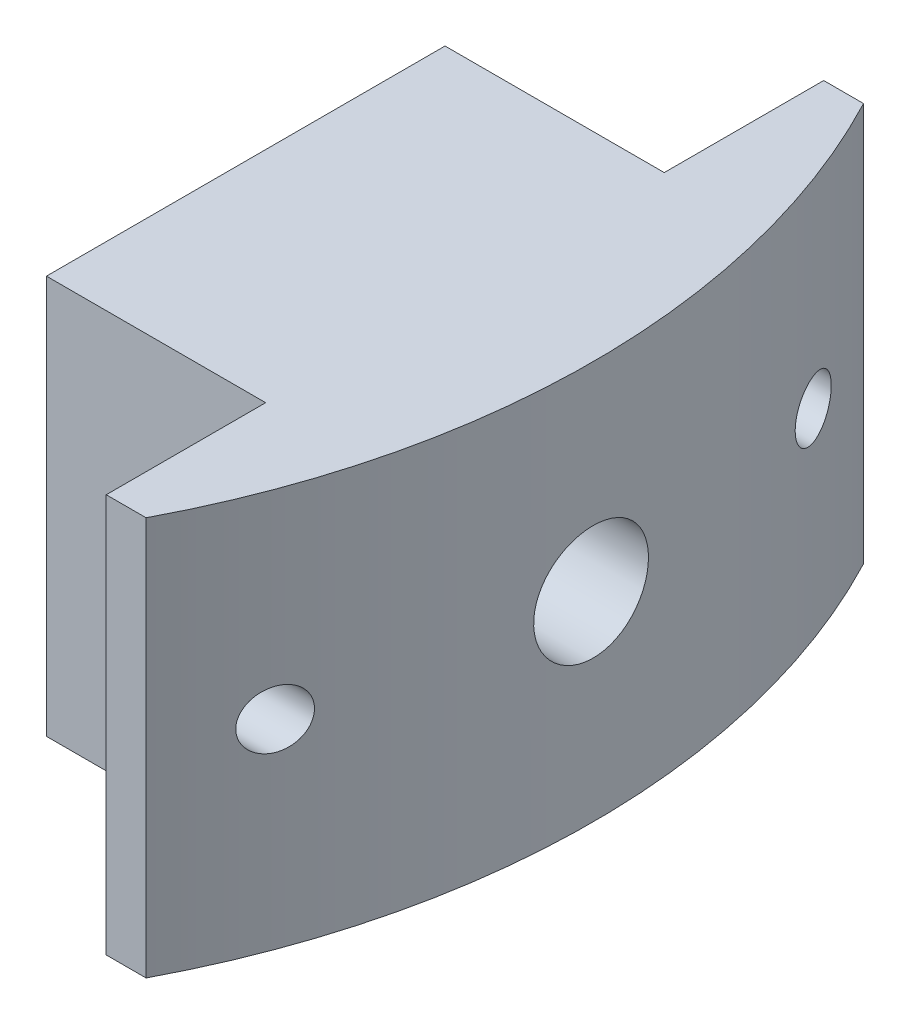
ISO-10303-21;
HEADER;
FILE_DESCRIPTION(('STEP AP214'),'2;1');
FILE_NAME('part.step','',(''),(''),'','','');
FILE_SCHEMA(('AUTOMOTIVE_DESIGN { 1 0 10303 214 1 1 1 1 }'));
ENDSEC;
DATA;
#1=APPLICATION_CONTEXT('core data for automotive mechanical design processes');
#2=APPLICATION_PROTOCOL_DEFINITION('international standard','automotive_design',2000,#1);
#3=PRODUCT_CONTEXT('',#1,'mechanical');
#4=PRODUCT('Part','Part','',(#3));
#5=PRODUCT_RELATED_PRODUCT_CATEGORY('part','',(#4));
#6=PRODUCT_DEFINITION_FORMATION('','',#4);
#7=PRODUCT_DEFINITION_CONTEXT('part definition',#1,'design');
#8=PRODUCT_DEFINITION('design','',#6,#7);
#9=PRODUCT_DEFINITION_SHAPE('','',#8);
#10=(LENGTH_UNIT() NAMED_UNIT(*) SI_UNIT(.MILLI.,.METRE.));
#11=(NAMED_UNIT(*) PLANE_ANGLE_UNIT() SI_UNIT($,.RADIAN.));
#12=(NAMED_UNIT(*) SI_UNIT($,.STERADIAN.) SOLID_ANGLE_UNIT());
#13=UNCERTAINTY_MEASURE_WITH_UNIT(LENGTH_MEASURE(1.E-05),#10,'distance_accuracy_value','');
#14=(GEOMETRIC_REPRESENTATION_CONTEXT(3) GLOBAL_UNCERTAINTY_ASSIGNED_CONTEXT((#13)) GLOBAL_UNIT_ASSIGNED_CONTEXT((#10,
#11,#12)) REPRESENTATION_CONTEXT('',''));
#15=CARTESIAN_POINT('',(0.,0.,0.));
#16=DIRECTION('',(0.,0.,1.));
#17=DIRECTION('',(1.,0.,0.));
#18=AXIS2_PLACEMENT_3D('',#15,#16,#17);
#19=CARTESIAN_POINT('',(0.,25.4,0.));
#20=DIRECTION('',(0.,-1.,0.));
#21=DIRECTION('',(0.,0.,-1.));
#22=AXIS2_PLACEMENT_3D('',#19,#20,#21);
#23=CYLINDRICAL_SURFACE('',#22,49.2125);
#24=CARTESIAN_POINT('',(46.7684099987374,12.7,-15.3162));
#25=CARTESIAN_POINT('',(46.7684086521971,12.6011724642372,-15.3162050057137));
#26=CARTESIAN_POINT('',(46.7657777660005,12.5022678312592,-15.3242448379959));
#27=CARTESIAN_POINT('',(46.7553157915948,12.3072429696195,-15.3561346399123));
#28=CARTESIAN_POINT('',(46.7474780959535,12.2111264410113,-15.3800046980093));
#29=CARTESIAN_POINT('',(46.7268223733524,12.0246036406234,-15.4426456876634));
#30=CARTESIAN_POINT('',(46.7140115203326,11.9341893605753,-15.4813951543245));
#31=CARTESIAN_POINT('',(46.6837441181245,11.7613487520306,-15.5724269406278));
#32=CARTESIAN_POINT('',(46.6662884399473,11.6789209298395,-15.6247067229756));
#33=CARTESIAN_POINT('',(46.6267802985042,11.5225179957934,-15.7422177568712));
#34=CARTESIAN_POINT('',(46.6046449600715,11.4487386838091,-15.8076813354027));
#35=CARTESIAN_POINT('',(46.5565335610681,11.3131886439074,-15.9488210154225));
#36=CARTESIAN_POINT('',(46.5305566652984,11.251420534141,-16.0244993374007));
#37=CARTESIAN_POINT('',(46.4740556356259,11.1384954267648,-16.1876525675942));
#38=CARTESIAN_POINT('',(46.4433744444337,11.0879792431591,-16.2755163413851));
#39=CARTESIAN_POINT('',(46.3792003762797,11.0023631522159,-16.4574980119421));
#40=CARTESIAN_POINT('',(46.3457067763539,10.9672672233832,-16.5516175155159));
#41=CARTESIAN_POINT('',(46.2748162469907,10.9115341872667,-16.7488234541507));
#42=CARTESIAN_POINT('',(46.2373061776796,10.8917819658347,-16.852119534));
#43=CARTESIAN_POINT('',(46.1609752261513,10.8701807805557,-17.0600938798005));
#44=CARTESIAN_POINT('',(46.1221540203343,10.8683362693725,-17.1647724830308));
#45=CARTESIAN_POINT('',(46.0425704848591,10.882747054891,-17.3771470130252));
#46=CARTESIAN_POINT('',(46.0017945998122,10.8997586788135,-17.4847872507144));
#47=CARTESIAN_POINT('',(45.9210870524939,10.9526891160619,-17.6956683139762));
#48=CARTESIAN_POINT('',(45.8811555156494,10.9886107182048,-17.7989084882052));
#49=CARTESIAN_POINT('',(45.8031371215393,11.0789642470719,-17.9987326248014));
#50=CARTESIAN_POINT('',(45.7650654047635,11.1335260125096,-18.0952640216327));
#51=CARTESIAN_POINT('',(45.6924819190473,11.2599804031564,-18.2777708051632));
#52=CARTESIAN_POINT('',(45.6579695847801,11.3318702701194,-18.3637478685921));
#53=CARTESIAN_POINT('',(45.5952828513195,11.4880913974879,-18.5188300658715));
#54=CARTESIAN_POINT('',(45.5669091983341,11.5718050976922,-18.5884751857033));
#55=CARTESIAN_POINT('',(45.5161521956982,11.75152292809,-18.7124169228493));
#56=CARTESIAN_POINT('',(45.4937656939147,11.8475205514904,-18.7667216174865));
#57=CARTESIAN_POINT('',(45.4575857373936,12.0414561193848,-18.8541809366939));
#58=CARTESIAN_POINT('',(45.4432800035134,12.1387279040556,-18.8886007660535));
#59=CARTESIAN_POINT('',(45.4216086360032,12.3383950109453,-18.9406556049076));
#60=CARTESIAN_POINT('',(45.414239681114,12.4407878564957,-18.9582986469983));
#61=CARTESIAN_POINT('',(45.4070966509364,12.6405541294195,-18.9753999988982));
#62=CARTESIAN_POINT('',(45.4068567594513,12.7378170805185,-18.9759736347808));
#63=CARTESIAN_POINT('',(45.412804751763,12.9309992323482,-18.9617346253601));
#64=CARTESIAN_POINT('',(45.4189916911404,13.0269186284147,-18.9469242407301));
#65=CARTESIAN_POINT('',(45.4373119842403,13.2129394614467,-18.9029464064817));
#66=CARTESIAN_POINT('',(45.4493356805496,13.3031147794746,-18.8740436727597));
#67=CARTESIAN_POINT('',(45.4787295220355,13.4771956954418,-18.8031056823425));
#68=CARTESIAN_POINT('',(45.4961003258762,13.5611005193896,-18.7610688077561));
#69=CARTESIAN_POINT('',(45.536189220959,13.7236136462891,-18.6635606173586));
#70=CARTESIAN_POINT('',(45.5590779917697,13.8019206210489,-18.6076583889299));
#71=CARTESIAN_POINT('',(45.6089443864387,13.9481035752348,-18.4850945507875));
#72=CARTESIAN_POINT('',(45.6359231702689,14.0159765844416,-18.4184298883816));
#73=CARTESIAN_POINT('',(45.6950284066856,14.1443255062568,-18.2713225619695));
#74=CARTESIAN_POINT('',(45.7273811979664,14.2039726044495,-18.1902479045402));
#75=CARTESIAN_POINT('',(45.7946471581998,14.3088700880425,-18.0202333208621));
#76=CARTESIAN_POINT('',(45.8295611604559,14.3541157620714,-17.9312908328179));
#77=CARTESIAN_POINT('',(45.9033690575196,14.4320159424258,-17.7415304899227));
#78=CARTESIAN_POINT('',(45.9423721054078,14.463604126166,-17.6403163910872));
#79=CARTESIAN_POINT('',(46.0209920351074,14.5088745002086,-17.434179770114));
#80=CARTESIAN_POINT('',(46.0606090676733,14.5225522200635,-17.3292563288342));
#81=CARTESIAN_POINT('',(46.1408391229792,14.5318158742304,-17.1145180433361));
#82=CARTESIAN_POINT('',(46.1814346586814,14.5267126726242,-17.0046660103387));
#83=CARTESIAN_POINT('',(46.2609817524735,14.4967875421471,-16.787052991022));
#84=CARTESIAN_POINT('',(46.2999332625077,14.4719650372923,-16.6792920658762));
#85=CARTESIAN_POINT('',(46.3748048807062,14.4031974266344,-16.4699694005561));
#86=CARTESIAN_POINT('',(46.4107465430992,14.3594052384463,-16.3683653431054));
#87=CARTESIAN_POINT('',(46.4789148005808,14.2535456660523,-16.173783333032));
#88=CARTESIAN_POINT('',(46.5111423993901,14.1914832355466,-16.0808030511776));
#89=CARTESIAN_POINT('',(46.5696024820653,14.0536747296366,-15.9106891299849));
#90=CARTESIAN_POINT('',(46.5960372776576,13.9786564806708,-15.8330360191128));
#91=CARTESIAN_POINT('',(46.6438848767419,13.8151583422248,-15.6915185636615));
#92=CARTESIAN_POINT('',(46.6652980772312,13.7266795178232,-15.6276531290878));
#93=CARTESIAN_POINT('',(46.7014026658666,13.5441626366254,-15.5194145748288));
#94=CARTESIAN_POINT('',(46.7164032359491,13.4507130525214,-15.4741504179755));
#95=CARTESIAN_POINT('',(46.7409002308169,13.2569555979401,-15.3999982151965));
#96=CARTESIAN_POINT('',(46.7504057763676,13.1566594028762,-15.3710830346315));
#97=CARTESIAN_POINT('',(46.7608151620969,12.9962675013319,-15.3393759219307));
#98=CARTESIAN_POINT('',(46.7636598295931,12.9373953394906,-15.3306983832038));
#99=CARTESIAN_POINT('',(46.7674576336007,12.8190247665182,-15.3191089751803));
#100=CARTESIAN_POINT('',(46.7684108097933,12.7595263685512,-15.3161969849298));
#101=CARTESIAN_POINT('',(46.7684099987374,12.7,-15.3162));
#102=B_SPLINE_CURVE_WITH_KNOTS('',3,(#24,#25,#26,#27,#28,#29,#30,#31,#32,#33,#34,#35,#36,#37,
#38,#39,#40,#41,#42,#43,#44,#45,#46,#47,#48,#49,#50,#51,#52,#53,#54,#55,#56,#57,#58,#59,#60,#61,
#62,#63,#64,#65,#66,#67,#68,#69,#70,#71,#72,#73,#74,#75,#76,#77,#78,#79,#80,#81,#82,#83,#84,#85,
#86,#87,#88,#89,#90,#91,#92,#93,#94,#95,#96,#97,#98,#99,#100,#101),.UNSPECIFIED.,.T.,.F.,(4,2,2,
2,2,2,2,2,2,2,2,2,2,2,2,2,2,2,2,2,2,2,2,2,2,2,2,2,2,2,2,2,2,2,2,2,2,2,4),(0.,0.296259338814519,
0.592895350200701,0.889105035206473,1.18525921321211,1.4871789743927,1.7891644731773,
2.10544701036159,2.42181110221167,2.7552895294915,3.0888508724121,3.43629171455644,
3.78378381114951,4.13374746882215,4.48365545685124,4.819473351923,5.15511409498784,
5.46598207550416,5.77670113977477,6.06706968754339,6.35739557184754,6.64246653834438,
6.9275726343402,7.2229905902932,7.51849248726369,7.83430056492126,8.15021185206085,
8.48762039415797,8.8251131373077,9.17511104336672,9.52511917293849,9.87235685961569,
10.2195004846174,10.551268468968,10.8830102155547,11.1961811572681,11.5088307871589,
11.6872791561261,11.865723781431),.UNSPECIFIED.);
#103=CARTESIAN_POINT('',(46.7684099987374,12.7,-15.3162));
#104=VERTEX_POINT('',#103);
#105=EDGE_CURVE('E210',#104,#104,#102,.T.);
#106=ORIENTED_EDGE('',*,*,#105,.F.);
#107=EDGE_LOOP('',(#106));
#108=FACE_BOUND('',#107,.T.);
#109=CARTESIAN_POINT('',(49.0763906424464,12.7,-3.65760000000001));
#110=CARTESIAN_POINT('',(49.0763924539215,12.4948556429095,-3.65759100680606));
#111=CARTESIAN_POINT('',(49.0776907688414,12.2895697629848,-3.64028302389104));
#112=CARTESIAN_POINT('',(49.0827440075584,11.8846725951792,-3.57148994820883));
#113=CARTESIAN_POINT('',(49.0865017502924,11.6850680934317,-3.51996563651635));
#114=CARTESIAN_POINT('',(49.0960458811427,11.2974568927662,-3.38423349369214));
#115=CARTESIAN_POINT('',(49.1018311560673,11.1094438961479,-3.30004359449011));
#116=CARTESIAN_POINT('',(49.1147770924699,10.7502648928534,-3.10140070972413));
#117=CARTESIAN_POINT('',(49.1219374500576,10.5790951764659,-2.98695440865909));
#118=CARTESIAN_POINT('',(49.1368434373881,10.2580605589493,-2.7307901982098));
#119=CARTESIAN_POINT('',(49.1445901151316,10.1082352554268,-2.5890227202828));
#120=CARTESIAN_POINT('',(49.1597862245454,9.83448212967929,-2.28234438776111));
#121=CARTESIAN_POINT('',(49.1672356434958,9.71055541470813,-2.11743254416868));
#122=CARTESIAN_POINT('',(49.1810074749461,9.49198941053713,-1.76891541365389));
#123=CARTESIAN_POINT('',(49.1873285878735,9.3973838019796,-1.58528894881));
#124=CARTESIAN_POINT('',(49.1981203829006,9.24036101122304,-1.20470313517021));
#125=CARTESIAN_POINT('',(49.2025910914979,9.17794336809255,-1.00774397734409));
#126=CARTESIAN_POINT('',(49.2091710536409,9.08718070589616,-0.606473079902298));
#127=CARTESIAN_POINT('',(49.2112846932167,9.05877239504998,-0.402175729182616));
#128=CARTESIAN_POINT('',(49.2129271916103,9.03663923948106,0.00829776446570221));
#129=CARTESIAN_POINT('',(49.2124560896536,9.04291386841689,0.214473878835186));
#130=CARTESIAN_POINT('',(49.2089858225819,9.08991651915138,0.622423381537657));
#131=CARTESIAN_POINT('',(49.2059916520959,9.13057647284314,0.824204660849548));
#132=CARTESIAN_POINT('',(49.1978179167889,9.24508984317437,1.21807037843477));
#133=CARTESIAN_POINT('',(49.1926383348162,9.31894352032983,1.41015474059014));
#134=CARTESIAN_POINT('',(49.1806681029075,9.49782433574217,1.77939156273732));
#135=CARTESIAN_POINT('',(49.1738758700651,9.60288212816587,1.95652911859023));
#136=CARTESIAN_POINT('',(49.1594441611752,9.84116669799135,2.29068133709093));
#137=CARTESIAN_POINT('',(49.151804671517,9.97439392794915,2.44769567638412));
#138=CARTESIAN_POINT('',(49.1365157687859,10.2656195514269,2.73754206058993));
#139=CARTESIAN_POINT('',(49.1288663763819,10.4236770605825,2.87031471686105));
#140=CARTESIAN_POINT('',(49.1144384794388,10.7598700471122,3.10745042129638));
#141=CARTESIAN_POINT('',(49.107659975423,10.9380055365501,3.21181345239057));
#142=CARTESIAN_POINT('',(49.095739754184,11.3093377289108,3.38916424446119));
#143=CARTESIAN_POINT('',(49.0905981835845,11.5025357790907,3.46214919504163));
#144=CARTESIAN_POINT('',(49.0825364869125,11.8984902322246,3.57462947368282));
#145=CARTESIAN_POINT('',(49.0796163237909,12.1012464757056,3.61412536028079));
#146=CARTESIAN_POINT('',(49.0763337664416,12.5100429041151,3.65843174416733));
#147=CARTESIAN_POINT('',(49.0759652742063,12.7160740795506,3.66332493590338));
#148=CARTESIAN_POINT('',(49.0778116689255,13.1260279110675,3.63850338787269));
#149=CARTESIAN_POINT('',(49.0800265367773,13.3299505827291,3.60878890401276));
#150=CARTESIAN_POINT('',(49.086784511573,13.7296630581417,3.51566431394816));
#151=CARTESIAN_POINT('',(49.091324968141,13.92546184634,3.45229256248853));
#152=CARTESIAN_POINT('',(49.1022202751595,14.303646393905,3.29369125049328));
#153=CARTESIAN_POINT('',(49.1085751488392,14.4860319815113,3.19846128208946));
#154=CARTESIAN_POINT('',(49.1223980078272,14.8325919640664,2.97863654487489));
#155=CARTESIAN_POINT('',(49.1298680775526,14.9967312304581,2.85398652790749));
#156=CARTESIAN_POINT('',(49.145072436177,15.3017847679267,2.57894012847181));
#157=CARTESIAN_POINT('',(49.152806728702,15.4426987201143,2.4285433925525));
#158=CARTESIAN_POINT('',(49.1676860596433,15.6975824958195,2.10591608584849));
#159=CARTESIAN_POINT('',(49.1748299071961,15.8114986917781,1.93364308550239));
#160=CARTESIAN_POINT('',(49.1877062894064,16.0087858075999,1.57236575462658));
#161=CARTESIAN_POINT('',(49.1934388356664,16.0921569785804,1.38336156166354));
#162=CARTESIAN_POINT('',(49.2028411460009,16.2258947856325,0.994181471114069));
#163=CARTESIAN_POINT('',(49.2065130048435,16.2762949466742,0.794017146681096));
#164=CARTESIAN_POINT('',(49.2113886608955,16.3427696966642,0.38803899214829));
#165=CARTESIAN_POINT('',(49.2125924943215,16.3588447893079,0.182225244994511));
#166=CARTESIAN_POINT('',(49.2123965440287,16.3562077223765,-0.228679873940785));
#167=CARTESIAN_POINT('',(49.2110030274044,16.3375792982832,-0.433771791325603));
#168=CARTESIAN_POINT('',(49.2057814136629,16.2662381451048,-0.837906344973103));
#169=CARTESIAN_POINT('',(49.2019533127312,16.2135253626179,-1.03694897175755));
#170=CARTESIAN_POINT('',(49.1922923846927,16.0755320770462,-1.42334341594362));
#171=CARTESIAN_POINT('',(49.1864596195539,15.9902525806537,-1.61069559450857));
#172=CARTESIAN_POINT('',(49.1734429989014,15.7895569096568,-1.96843585143513));
#173=CARTESIAN_POINT('',(49.1662591711148,15.6741413534996,-2.13882427782492));
#174=CARTESIAN_POINT('',(49.1513269369548,15.4161366741602,-2.4582277379397));
#175=CARTESIAN_POINT('',(49.1435772775094,15.273486036024,-2.60719302224091));
#176=CARTESIAN_POINT('',(49.128397321283,14.9651622829508,-2.87912026490262));
#177=CARTESIAN_POINT('',(49.1209671026717,14.7994835743645,-3.0020758870126));
#178=CARTESIAN_POINT('',(49.10725448086,14.4495476686795,-3.21862420939656));
#179=CARTESIAN_POINT('',(49.1009739025441,14.2652616423563,-3.31217039250988));
#180=CARTESIAN_POINT('',(49.090294358755,13.8836815636051,-3.46687544399207));
#181=CARTESIAN_POINT('',(49.085893212172,13.6864028980473,-3.52807187448911));
#182=CARTESIAN_POINT('',(49.0806128491451,13.3566165062733,-3.60060440962733));
#183=CARTESIAN_POINT('',(49.0790367045938,13.2262350315591,-3.62194970808312));
#184=CARTESIAN_POINT('',(49.0769250195616,12.963921897643,-3.65045038179332));
#185=CARTESIAN_POINT('',(49.0763894769401,12.8319902416304,-3.65760578623688));
#186=CARTESIAN_POINT('',(49.0763906424464,12.7,-3.65760000000001));
#187=B_SPLINE_CURVE_WITH_KNOTS('',3,(#109,#110,#111,#112,#113,#114,#115,#116,#117,#118,#119,
#120,#121,#122,#123,#124,#125,#126,#127,#128,#129,#130,#131,#132,#133,#134,#135,#136,#137,#138,
#139,#140,#141,#142,#143,#144,#145,#146,#147,#148,#149,#150,#151,#152,#153,#154,#155,#156,#157,
#158,#159,#160,#161,#162,#163,#164,#165,#166,#167,#168,#169,#170,#171,#172,#173,#174,#175,#176,
#177,#178,#179,#180,#181,#182,#183,#184,#185,#186),.UNSPECIFIED.,.T.,.F.,(4,2,2,2,2,2,2,2,2,2,2,
2,2,2,2,2,2,2,2,2,2,2,2,2,2,2,2,2,2,2,2,2,2,2,2,2,2,2,4),(0.,0.614951185792431,1.23060845107773,
1.84592822545913,2.46111217165609,3.07742293011323,3.69376003259075,4.31080250900396,
4.9278361491271,5.54371968816141,6.1595938806944,6.77425175418898,7.38891445181857,
8.00418298765852,8.61946140884458,9.23622751982482,9.85299400139023,10.469815712501,
11.086627135935,11.7019639872088,12.3172962883969,12.9319288764142,13.5465693336313,
14.1623733442518,14.7781858093099,15.3952114417801,16.0122320014334,16.6286241945064,
17.2450073424108,17.8599051566334,18.4748039342492,19.0896837058397,19.7045508599624,
20.3208235846617,20.9372462679736,21.5546391032479,22.1713134844285,22.5669749772433,
22.9626356561663),.UNSPECIFIED.);
#188=CARTESIAN_POINT('',(49.0763906424464,12.7,-3.65760000000001));
#189=VERTEX_POINT('',#188);
#190=EDGE_CURVE('E12',#189,#189,#187,.T.);
#191=ORIENTED_EDGE('',*,*,#190,.T.);
#192=EDGE_LOOP('',(#191));
#193=FACE_BOUND('',#192,.T.);
#194=CARTESIAN_POINT('',(0.,0.,0.));
#195=DIRECTION('',(0.,1.,0.));
#196=DIRECTION('',(0.,0.,1.));
#197=AXIS2_PLACEMENT_3D('',#194,#195,#196);
#198=CIRCLE('',#197,49.2125);
#199=CARTESIAN_POINT('',(43.5808507976841,0.,22.86));
#200=VERTEX_POINT('',#199);
#201=CARTESIAN_POINT('',(43.5808507976841,0.,-22.86));
#202=VERTEX_POINT('',#201);
#203=EDGE_CURVE('E289',#200,#202,#198,.T.);
#204=ORIENTED_EDGE('',*,*,#203,.T.);
#205=DIRECTION('',(0.,-1.,0.));
#206=VECTOR('',#205,1.);
#207=CARTESIAN_POINT('',(43.5808507976841,25.4,-22.86));
#208=LINE('',#207,#206);
#209=CARTESIAN_POINT('',(43.5808507976841,25.4,-22.86));
#210=VERTEX_POINT('',#209);
#211=EDGE_CURVE('E172',#210,#202,#208,.T.);
#212=ORIENTED_EDGE('',*,*,#211,.F.);
#213=CARTESIAN_POINT('',(0.,25.4,0.));
#214=DIRECTION('',(0.,1.,0.));
#215=DIRECTION('',(0.,0.,1.));
#216=AXIS2_PLACEMENT_3D('',#213,#214,#215);
#217=CIRCLE('',#216,49.2125);
#218=CARTESIAN_POINT('',(43.5808507976841,25.4,22.86));
#219=VERTEX_POINT('',#218);
#220=EDGE_CURVE('E163',#219,#210,#217,.T.);
#221=ORIENTED_EDGE('',*,*,#220,.F.);
#222=DIRECTION('',(0.,-1.,0.));
#223=VECTOR('',#222,1.);
#224=CARTESIAN_POINT('',(43.5808507976841,25.4,22.86));
#225=LINE('',#224,#223);
#226=EDGE_CURVE('E306',#219,#200,#225,.T.);
#227=ORIENTED_EDGE('',*,*,#226,.T.);
#228=EDGE_LOOP('',(#204,#212,#221,#227));
#229=FACE_BOUND('',#228,.T.);
#230=CARTESIAN_POINT('',(45.4077644220677,12.7,18.9738));
#231=CARTESIAN_POINT('',(45.4077669262153,12.7970446404455,18.9737947179405));
#232=CARTESIAN_POINT('',(45.4110099088364,12.8941670842188,18.9660387343693));
#233=CARTESIAN_POINT('',(45.4238288201605,13.0856208736305,18.9353160995243));
#234=CARTESIAN_POINT('',(45.4334130119078,13.1799484095235,18.912329601756));
#235=CARTESIAN_POINT('',(45.4584191214234,13.362885821621,18.852144133339));
#236=CARTESIAN_POINT('',(45.4738280468525,13.4515079129465,18.8149767920104));
#237=CARTESIAN_POINT('',(45.5097909533621,13.6210175609357,18.727821433832));
#238=CARTESIAN_POINT('',(45.5303444016407,13.7019059173595,18.6778347446281));
#239=CARTESIAN_POINT('',(45.5765566426959,13.8568081060672,18.5647915124594));
#240=CARTESIAN_POINT('',(45.6023655248908,13.9304938040263,18.5013476813668));
#241=CARTESIAN_POINT('',(45.6576613165247,14.0662788285649,18.3644647456801));
#242=CARTESIAN_POINT('',(45.6871493525864,14.1283745914989,18.2910225787861));
#243=CARTESIAN_POINT('',(45.7511022643653,14.2439521698834,18.1304930488276));
#244=CARTESIAN_POINT('',(45.7857729968842,14.2964822669557,18.0428023007857));
#245=CARTESIAN_POINT('',(45.8571552909513,14.3860426369286,17.8606003211613));
#246=CARTESIAN_POINT('',(45.8938675180836,14.423067820836,17.7660868621559));
#247=CARTESIAN_POINT('',(45.9705955445098,14.4827575250136,17.566632958564));
#248=CARTESIAN_POINT('',(46.0106754576843,14.5043957039984,17.4614089281674));
#249=CARTESIAN_POINT('',(46.0908097954272,14.5289885531311,17.2487774610334));
#250=CARTESIAN_POINT('',(46.1308642136189,14.5319396327873,17.1413696086788));
#251=CARTESIAN_POINT('',(46.2108229623938,14.5187966732795,16.9246463287715));
#252=CARTESIAN_POINT('',(46.2506997230773,14.5022356207556,16.8153483993263));
#253=CARTESIAN_POINT('',(46.328159578554,14.449429989262,16.6007470549437));
#254=CARTESIAN_POINT('',(46.3657427841644,14.4131863621299,16.4954434471068));
#255=CARTESIAN_POINT('',(46.4368160956373,14.3225595592882,16.2942758967126));
#256=CARTESIAN_POINT('',(46.4703737993362,14.2685595182457,16.1982637324166));
#257=CARTESIAN_POINT('',(46.5332994004954,14.1433906943784,16.0165992401507));
#258=CARTESIAN_POINT('',(46.5626685051461,14.0722268742794,15.9309439283342));
#259=CARTESIAN_POINT('',(46.6149781663402,13.918549398485,15.7772064624074));
#260=CARTESIAN_POINT('',(46.6381685002004,13.8367905781343,15.7084552181711));
#261=CARTESIAN_POINT('',(46.6793075231841,13.6616479211154,15.585782168903));
#262=CARTESIAN_POINT('',(46.6972580682869,13.5682682174237,15.5318551134083));
#263=CARTESIAN_POINT('',(46.726543935076,13.3781253278627,15.4435197820858));
#264=CARTESIAN_POINT('',(46.7381898806466,13.2818339136592,15.4081979203201));
#265=CARTESIAN_POINT('',(46.7559933642415,13.0842309821873,15.3540894523521));
#266=CARTESIAN_POINT('',(46.7621523181768,12.982920767141,15.3352985803656));
#267=CARTESIAN_POINT('',(46.7686791235709,12.7823243967867,15.3153815932179));
#268=CARTESIAN_POINT('',(46.7692593597524,12.6831089217014,15.313607641097));
#269=CARTESIAN_POINT('',(46.7651673593571,12.4858097652316,15.3260993313129));
#270=CARTESIAN_POINT('',(46.7604956487661,12.3877259715023,15.3403633674351));
#271=CARTESIAN_POINT('',(46.7461017548906,12.1965064364538,15.3841686423257));
#272=CARTESIAN_POINT('',(46.7364323784836,12.1033299704819,15.413550131062));
#273=CARTESIAN_POINT('',(46.7123244894025,11.9233569699307,15.4864573909856));
#274=CARTESIAN_POINT('',(46.6978857336566,11.8365607607974,15.5299838830724));
#275=CARTESIAN_POINT('',(46.664287941254,11.6699996324518,15.6306507740823));
#276=CARTESIAN_POINT('',(46.6450459373923,11.5903959286576,15.68802980697));
#277=CARTESIAN_POINT('',(46.6024621837766,11.441968118069,15.8140789192295));
#278=CARTESIAN_POINT('',(46.579119741716,11.3731458352978,15.8827509051469));
#279=CARTESIAN_POINT('',(46.5278267872817,11.2450980654769,16.0324044675893));
#280=CARTESIAN_POINT('',(46.4997240458057,11.186396269747,16.1137815789483));
#281=CARTESIAN_POINT('',(46.440339932799,11.083417487093,16.2841370680043));
#282=CARTESIAN_POINT('',(46.4090577975285,11.0391439768618,16.3731172712603));
#283=CARTESIAN_POINT('',(46.3422849641091,10.9637716538783,16.5611971530815));
#284=CARTESIAN_POINT('',(46.3066584345403,10.9335088308773,16.6605836822467));
#285=CARTESIAN_POINT('',(46.2335556638749,10.8902221575582,16.8623845578082));
#286=CARTESIAN_POINT('',(46.1960789366909,10.8772028627611,16.964799697022));
#287=CARTESIAN_POINT('',(46.1183721856851,10.8682810671002,17.1749537492594));
#288=CARTESIAN_POINT('',(46.0780963131919,10.8732293666318,17.2827124356476));
#289=CARTESIAN_POINT('',(45.9976309566718,10.9019330506889,17.4957445848948));
#290=CARTESIAN_POINT('',(45.9574414909064,10.925692081088,17.6010175619028));
#291=CARTESIAN_POINT('',(45.8775306368869,10.9921806956535,17.8082824056543));
#292=CARTESIAN_POINT('',(45.8378351491591,11.0352841901514,17.9101648710943));
#293=CARTESIAN_POINT('',(45.7611183549443,11.1396771628102,18.1052810091642));
#294=CARTESIAN_POINT('',(45.7240968543224,11.2009653190878,18.1985153098019));
#295=CARTESIAN_POINT('',(45.655064055533,11.3386417893509,18.3710017952298));
#296=CARTESIAN_POINT('',(45.6229496656445,11.414608661304,18.4505481398514));
#297=CARTESIAN_POINT('',(45.5640458013872,11.5808065274528,18.5955377895739));
#298=CARTESIAN_POINT('',(45.5372554983225,11.6710352978477,18.6609832896098));
#299=CARTESIAN_POINT('',(45.4919404880856,11.8568102865007,18.7711702356082));
#300=CARTESIAN_POINT('',(45.4729860139908,11.9516090991102,18.8169954569552));
#301=CARTESIAN_POINT('',(45.4419407037823,12.1485597907471,18.8918460138188));
#302=CARTESIAN_POINT('',(45.4298362715584,12.2506966474875,18.9209046303145));
#303=CARTESIAN_POINT('',(45.4169391263653,12.4115132874756,18.951831587237));
#304=CARTESIAN_POINT('',(45.4135055981547,12.4688371051807,18.9600553992909));
#305=CARTESIAN_POINT('',(45.4089175311032,12.5840980411926,18.9710411041635));
#306=CARTESIAN_POINT('',(45.407762926338,12.6420351417099,18.9738031549793));
#307=CARTESIAN_POINT('',(45.4077644220677,12.7,18.9738));
#308=B_SPLINE_CURVE_WITH_KNOTS('',3,(#230,#231,#232,#233,#234,#235,#236,#237,#238,#239,#240,
#241,#242,#243,#244,#245,#246,#247,#248,#249,#250,#251,#252,#253,#254,#255,#256,#257,#258,#259,
#260,#261,#262,#263,#264,#265,#266,#267,#268,#269,#270,#271,#272,#273,#274,#275,#276,#277,#278,
#279,#280,#281,#282,#283,#284,#285,#286,#287,#288,#289,#290,#291,#292,#293,#294,#295,#296,#297,
#298,#299,#300,#301,#302,#303,#304,#305,#306,#307),.UNSPECIFIED.,.T.,.F.,(4,2,2,2,2,2,2,2,2,2,2,
2,2,2,2,2,2,2,2,2,2,2,2,2,2,2,2,2,2,2,2,2,2,2,2,2,2,2,4),(0.,0.290911742229181,0.58220331161223,
0.872848939300425,1.16346447819278,1.46398192016058,1.76459161283987,2.0870094348739,
2.40953299748726,2.75194497603559,3.09442274275533,3.44526688132525,3.79609405479615,
4.13980004140205,4.48340676792961,4.80965796070186,5.13579345180738,5.44391502994817,
5.75195707467427,6.04822311271885,6.34445948217443,6.63762784611677,6.93081115371627,
7.22945925155751,7.52815782086508,7.8393866419116,8.15069040244578,8.47872571290517,
8.80684766885051,9.1507051474142,9.49462928834448,9.84550833116639,10.1963618740602,
10.5383353892096,10.8802556343002,11.1995413844878,11.5181911665724,11.691958060428,
11.8657199275011),.UNSPECIFIED.);
#309=CARTESIAN_POINT('',(45.4077644220677,12.7,18.9738));
#310=VERTEX_POINT('',#309);
#311=EDGE_CURVE('E219',#310,#310,#308,.T.);
#312=ORIENTED_EDGE('',*,*,#311,.T.);
#313=EDGE_LOOP('',(#312));
#314=FACE_BOUND('',#313,.T.);
#315=ADVANCED_FACE('F78',(#108,#193,#229,#314),#23,.T.);
#316=CARTESIAN_POINT('',(49.2135,12.7,0.));
#317=DIRECTION('',(-1.,0.,0.));
#318=DIRECTION('',(0.,0.,1.));
#319=AXIS2_PLACEMENT_3D('',#316,#317,#318);
#320=CYLINDRICAL_SURFACE('',#319,1.27);
#321=CARTESIAN_POINT('',(27.0708507976841,12.7,0.));
#322=DIRECTION('',(-1.,0.,0.));
#323=DIRECTION('',(0.,0.,1.));
#324=AXIS2_PLACEMENT_3D('',#321,#322,#323);
#325=CIRCLE('',#324,1.27);
#326=CARTESIAN_POINT('',(27.0708507976841,12.7,1.27));
#327=VERTEX_POINT('',#326);
#328=EDGE_CURVE('E201',#327,#327,#325,.T.);
#329=ORIENTED_EDGE('',*,*,#328,.T.);
#330=EDGE_LOOP('',(#329));
#331=FACE_BOUND('',#330,.T.);
#332=CARTESIAN_POINT('',(36.5125,12.7,0.));
#333=DIRECTION('',(1.,0.,0.));
#334=DIRECTION('',(0.,0.,-1.));
#335=AXIS2_PLACEMENT_3D('',#332,#333,#334);
#336=CIRCLE('',#335,1.27);
#337=CARTESIAN_POINT('',(36.5125,12.7,-1.27000000000001));
#338=VERTEX_POINT('',#337);
#339=EDGE_CURVE('E205',#338,#338,#336,.F.);
#340=ORIENTED_EDGE('',*,*,#339,.F.);
#341=EDGE_LOOP('',(#340));
#342=FACE_BOUND('',#341,.T.);
#343=ADVANCED_FACE('F240',(#331,#342),#320,.F.);
#344=CARTESIAN_POINT('',(0.,0.,0.));
#345=DIRECTION('',(0.,1.,0.));
#346=DIRECTION('',(0.,0.,1.));
#347=AXIS2_PLACEMENT_3D('',#344,#345,#346);
#348=PLANE('',#347);
#349=ORIENTED_EDGE('',*,*,#203,.F.);
#350=DIRECTION('',(-1.,0.,0.));
#351=VECTOR('',#350,1.);
#352=CARTESIAN_POINT('',(0.,0.,22.8599999999999));
#353=LINE('',#352,#351);
#354=CARTESIAN_POINT('',(41.0408507976841,0.,22.86));
#355=VERTEX_POINT('',#354);
#356=EDGE_CURVE('E285',#200,#355,#353,.T.);
#357=ORIENTED_EDGE('',*,*,#356,.T.);
#358=DIRECTION('',(0.,0.,1.));
#359=VECTOR('',#358,1.);
#360=CARTESIAN_POINT('',(41.0408507976841,0.,0.));
#361=LINE('',#360,#359);
#362=CARTESIAN_POINT('',(41.0408507976841,0.,12.7));
#363=VERTEX_POINT('',#362);
#364=EDGE_CURVE('E275',#363,#355,#361,.T.);
#365=ORIENTED_EDGE('',*,*,#364,.F.);
#366=DIRECTION('',(1.,0.,0.));
#367=VECTOR('',#366,1.);
#368=CARTESIAN_POINT('',(0.,0.,12.7));
#369=LINE('',#368,#367);
#370=CARTESIAN_POINT('',(27.0708507976841,0.,12.7));
#371=VERTEX_POINT('',#370);
#372=EDGE_CURVE('E267',#371,#363,#369,.T.);
#373=ORIENTED_EDGE('',*,*,#372,.F.);
#374=DIRECTION('',(0.,0.,1.));
#375=VECTOR('',#374,1.);
#376=CARTESIAN_POINT('',(27.0708507976841,0.,0.));
#377=LINE('',#376,#375);
#378=CARTESIAN_POINT('',(27.0708507976841,0.,-12.7));
#379=VERTEX_POINT('',#378);
#380=EDGE_CURVE('E204',#379,#371,#377,.T.);
#381=ORIENTED_EDGE('',*,*,#380,.F.);
#382=DIRECTION('',(-1.,0.,0.));
#383=VECTOR('',#382,1.);
#384=CARTESIAN_POINT('',(0.,0.,-12.7));
#385=LINE('',#384,#383);
#386=CARTESIAN_POINT('',(41.0408507976841,0.,-12.7));
#387=VERTEX_POINT('',#386);
#388=EDGE_CURVE('E133',#387,#379,#385,.T.);
#389=ORIENTED_EDGE('',*,*,#388,.F.);
#390=CARTESIAN_POINT('',(41.0408507976841,0.,-22.86));
#391=VERTEX_POINT('',#390);
#392=EDGE_CURVE('E127',#391,#387,#361,.T.);
#393=ORIENTED_EDGE('',*,*,#392,.F.);
#394=DIRECTION('',(-1.,0.,0.));
#395=VECTOR('',#394,1.);
#396=CARTESIAN_POINT('',(0.,0.,-22.8599999999999));
#397=LINE('',#396,#395);
#398=EDGE_CURVE('E170',#202,#391,#397,.T.);
#399=ORIENTED_EDGE('',*,*,#398,.F.);
#400=EDGE_LOOP('',(#349,#357,#365,#373,#381,#389,#393,#399));
#401=FACE_BOUND('',#400,.T.);
#402=ADVANCED_FACE('F283',(#401),#348,.F.);
#403=CARTESIAN_POINT('',(0.,25.4,0.));
#404=DIRECTION('',(0.,1.,0.));
#405=DIRECTION('',(0.,0.,1.));
#406=AXIS2_PLACEMENT_3D('',#403,#404,#405);
#407=PLANE('',#406);
#408=ORIENTED_EDGE('',*,*,#220,.T.);
#409=DIRECTION('',(-1.,0.,0.));
#410=VECTOR('',#409,1.);
#411=CARTESIAN_POINT('',(0.,25.4,-22.8599999999999));
#412=LINE('',#411,#410);
#413=CARTESIAN_POINT('',(41.0408507976841,25.4,-22.86));
#414=VERTEX_POINT('',#413);
#415=EDGE_CURVE('E156',#210,#414,#412,.T.);
#416=ORIENTED_EDGE('',*,*,#415,.T.);
#417=DIRECTION('',(0.,0.,1.));
#418=VECTOR('',#417,1.);
#419=CARTESIAN_POINT('',(41.0408507976841,25.4,0.));
#420=LINE('',#419,#418);
#421=CARTESIAN_POINT('',(41.0408507976841,25.4,-12.7));
#422=VERTEX_POINT('',#421);
#423=EDGE_CURVE('E160',#414,#422,#420,.T.);
#424=ORIENTED_EDGE('',*,*,#423,.T.);
#425=DIRECTION('',(-1.,0.,0.));
#426=VECTOR('',#425,1.);
#427=CARTESIAN_POINT('',(0.,25.4,-12.7));
#428=LINE('',#427,#426);
#429=CARTESIAN_POINT('',(27.0708507976841,25.4,-12.7));
#430=VERTEX_POINT('',#429);
#431=EDGE_CURVE('E98',#422,#430,#428,.T.);
#432=ORIENTED_EDGE('',*,*,#431,.T.);
#433=DIRECTION('',(0.,0.,1.));
#434=VECTOR('',#433,1.);
#435=CARTESIAN_POINT('',(27.0708507976841,25.4,0.));
#436=LINE('',#435,#434);
#437=CARTESIAN_POINT('',(27.0708507976841,25.4,12.7));
#438=VERTEX_POINT('',#437);
#439=EDGE_CURVE('E195',#430,#438,#436,.T.);
#440=ORIENTED_EDGE('',*,*,#439,.T.);
#441=DIRECTION('',(1.,0.,0.));
#442=VECTOR('',#441,1.);
#443=CARTESIAN_POINT('',(0.,25.4,12.7));
#444=LINE('',#443,#442);
#445=CARTESIAN_POINT('',(41.0408507976841,25.4,12.7));
#446=VERTEX_POINT('',#445);
#447=EDGE_CURVE('E142',#438,#446,#444,.T.);
#448=ORIENTED_EDGE('',*,*,#447,.T.);
#449=CARTESIAN_POINT('',(41.0408507976841,25.4,22.86));
#450=VERTEX_POINT('',#449);
#451=EDGE_CURVE('E178',#446,#450,#420,.T.);
#452=ORIENTED_EDGE('',*,*,#451,.T.);
#453=DIRECTION('',(-1.,0.,0.));
#454=VECTOR('',#453,1.);
#455=CARTESIAN_POINT('',(0.,25.4,22.8599999999999));
#456=LINE('',#455,#454);
#457=EDGE_CURVE('E187',#219,#450,#456,.T.);
#458=ORIENTED_EDGE('',*,*,#457,.F.);
#459=EDGE_LOOP('',(#408,#416,#424,#432,#440,#448,#452,#458));
#460=FACE_BOUND('',#459,.T.);
#461=ADVANCED_FACE('F158',(#460),#407,.T.);
#462=CARTESIAN_POINT('',(0.,25.4,-22.8599999999999));
#463=DIRECTION('',(0.,0.,1.));
#464=DIRECTION('',(1.,0.,0.));
#465=AXIS2_PLACEMENT_3D('',#462,#463,#464);
#466=PLANE('',#465);
#467=ORIENTED_EDGE('',*,*,#398,.T.);
#468=DIRECTION('',(0.,-1.,0.));
#469=VECTOR('',#468,1.);
#470=CARTESIAN_POINT('',(41.0408507976841,25.4,-22.86));
#471=LINE('',#470,#469);
#472=EDGE_CURVE('E167',#414,#391,#471,.T.);
#473=ORIENTED_EDGE('',*,*,#472,.F.);
#474=ORIENTED_EDGE('',*,*,#415,.F.);
#475=ORIENTED_EDGE('',*,*,#211,.T.);
#476=EDGE_LOOP('',(#467,#473,#474,#475));
#477=FACE_BOUND('',#476,.T.);
#478=ADVANCED_FACE('F168',(#477),#466,.F.);
#479=CARTESIAN_POINT('',(41.0408507976841,25.4,0.));
#480=DIRECTION('',(1.,0.,0.));
#481=DIRECTION('',(0.,0.,-1.));
#482=AXIS2_PLACEMENT_3D('',#479,#480,#481);
#483=PLANE('',#482);
#484=CARTESIAN_POINT('',(41.0408507976841,12.7,-17.145));
#485=DIRECTION('',(1.,0.,0.));
#486=DIRECTION('',(0.,0.,-1.));
#487=AXIS2_PLACEMENT_3D('',#484,#485,#486);
#488=CIRCLE('',#487,1.8288);
#489=CARTESIAN_POINT('',(41.0408507976841,12.7,-18.9738));
#490=VERTEX_POINT('',#489);
#491=EDGE_CURVE('E82',#490,#490,#488,.T.);
#492=ORIENTED_EDGE('',*,*,#491,.T.);
#493=EDGE_LOOP('',(#492));
#494=FACE_BOUND('',#493,.T.);
#495=ORIENTED_EDGE('',*,*,#392,.T.);
#496=DIRECTION('',(0.,-1.,0.));
#497=VECTOR('',#496,1.);
#498=CARTESIAN_POINT('',(41.0408507976841,25.4,-12.7));
#499=LINE('',#498,#497);
#500=EDGE_CURVE('E173',#422,#387,#499,.T.);
#501=ORIENTED_EDGE('',*,*,#500,.F.);
#502=ORIENTED_EDGE('',*,*,#423,.F.);
#503=ORIENTED_EDGE('',*,*,#472,.T.);
#504=EDGE_LOOP('',(#495,#501,#502,#503));
#505=FACE_BOUND('',#504,.T.);
#506=ADVANCED_FACE('F175',(#494,#505),#483,.F.);
#507=CARTESIAN_POINT('',(0.,25.4,-12.7));
#508=DIRECTION('',(0.,0.,1.));
#509=DIRECTION('',(1.,0.,0.));
#510=AXIS2_PLACEMENT_3D('',#507,#508,#509);
#511=PLANE('',#510);
#512=ORIENTED_EDGE('',*,*,#388,.T.);
#513=DIRECTION('',(0.,-1.,0.));
#514=VECTOR('',#513,1.);
#515=CARTESIAN_POINT('',(27.0708507976841,25.4,-12.7));
#516=LINE('',#515,#514);
#517=EDGE_CURVE('E182',#430,#379,#516,.T.);
#518=ORIENTED_EDGE('',*,*,#517,.F.);
#519=ORIENTED_EDGE('',*,*,#431,.F.);
#520=ORIENTED_EDGE('',*,*,#500,.T.);
#521=EDGE_LOOP('',(#512,#518,#519,#520));
#522=FACE_BOUND('',#521,.T.);
#523=ADVANCED_FACE('F265',(#522),#511,.F.);
#524=CARTESIAN_POINT('',(27.0708507976841,25.4,0.));
#525=DIRECTION('',(1.,0.,0.));
#526=DIRECTION('',(0.,0.,-1.));
#527=AXIS2_PLACEMENT_3D('',#524,#525,#526);
#528=PLANE('',#527);
#529=ORIENTED_EDGE('',*,*,#328,.F.);
#530=EDGE_LOOP('',(#529));
#531=FACE_BOUND('',#530,.T.);
#532=ORIENTED_EDGE('',*,*,#380,.T.);
#533=DIRECTION('',(0.,-1.,0.));
#534=VECTOR('',#533,1.);
#535=CARTESIAN_POINT('',(27.0708507976841,25.4,12.7));
#536=LINE('',#535,#534);
#537=EDGE_CURVE('E89',#438,#371,#536,.T.);
#538=ORIENTED_EDGE('',*,*,#537,.F.);
#539=ORIENTED_EDGE('',*,*,#439,.F.);
#540=ORIENTED_EDGE('',*,*,#517,.T.);
#541=EDGE_LOOP('',(#532,#538,#539,#540));
#542=FACE_BOUND('',#541,.T.);
#543=ADVANCED_FACE('F80',(#531,#542),#528,.F.);
#544=CARTESIAN_POINT('',(0.,25.4,12.7));
#545=DIRECTION('',(0.,0.,-1.));
#546=DIRECTION('',(-1.,0.,0.));
#547=AXIS2_PLACEMENT_3D('',#544,#545,#546);
#548=PLANE('',#547);
#549=ORIENTED_EDGE('',*,*,#372,.T.);
#550=DIRECTION('',(0.,-1.,0.));
#551=VECTOR('',#550,1.);
#552=CARTESIAN_POINT('',(41.0408507976841,25.4,12.7));
#553=LINE('',#552,#551);
#554=EDGE_CURVE('E269',#446,#363,#553,.T.);
#555=ORIENTED_EDGE('',*,*,#554,.F.);
#556=ORIENTED_EDGE('',*,*,#447,.F.);
#557=ORIENTED_EDGE('',*,*,#537,.T.);
#558=EDGE_LOOP('',(#549,#555,#556,#557));
#559=FACE_BOUND('',#558,.T.);
#560=ADVANCED_FACE('F258',(#559),#548,.F.);
#561=CARTESIAN_POINT('',(41.0408507976841,12.7,17.145));
#562=DIRECTION('',(1.,0.,0.));
#563=DIRECTION('',(0.,0.,-1.));
#564=AXIS2_PLACEMENT_3D('',#561,#562,#563);
#565=CIRCLE('',#564,1.8288);
#566=CARTESIAN_POINT('',(41.0408507976841,12.7,15.3162));
#567=VERTEX_POINT('',#566);
#568=EDGE_CURVE('E248',#567,#567,#565,.F.);
#569=ORIENTED_EDGE('',*,*,#568,.F.);
#570=EDGE_LOOP('',(#569));
#571=FACE_BOUND('',#570,.T.);
#572=ORIENTED_EDGE('',*,*,#364,.T.);
#573=DIRECTION('',(0.,-1.,0.));
#574=VECTOR('',#573,1.);
#575=CARTESIAN_POINT('',(41.0408507976841,25.4,22.86));
#576=LINE('',#575,#574);
#577=EDGE_CURVE('E280',#450,#355,#576,.T.);
#578=ORIENTED_EDGE('',*,*,#577,.F.);
#579=ORIENTED_EDGE('',*,*,#451,.F.);
#580=ORIENTED_EDGE('',*,*,#554,.T.);
#581=EDGE_LOOP('',(#572,#578,#579,#580));
#582=FACE_BOUND('',#581,.T.);
#583=ADVANCED_FACE('F256',(#571,#582),#483,.F.);
#584=CARTESIAN_POINT('',(0.,25.4,22.8599999999999));
#585=DIRECTION('',(0.,0.,1.));
#586=DIRECTION('',(1.,0.,0.));
#587=AXIS2_PLACEMENT_3D('',#584,#585,#586);
#588=PLANE('',#587);
#589=ORIENTED_EDGE('',*,*,#356,.F.);
#590=ORIENTED_EDGE('',*,*,#226,.F.);
#591=ORIENTED_EDGE('',*,*,#457,.T.);
#592=ORIENTED_EDGE('',*,*,#577,.T.);
#593=EDGE_LOOP('',(#589,#590,#591,#592));
#594=FACE_BOUND('',#593,.T.);
#595=ADVANCED_FACE('F238',(#594),#588,.T.);
#596=CARTESIAN_POINT('',(36.5125,12.7,0.));
#597=DIRECTION('',(1.,0.,0.));
#598=DIRECTION('',(0.,0.,-1.));
#599=AXIS2_PLACEMENT_3D('',#596,#597,#598);
#600=CYLINDRICAL_SURFACE('',#599,3.6576);
#601=CARTESIAN_POINT('',(36.5125,12.7,0.));
#602=DIRECTION('',(1.,0.,0.));
#603=DIRECTION('',(0.,0.,-1.));
#604=AXIS2_PLACEMENT_3D('',#601,#602,#603);
#605=CIRCLE('',#604,3.6576);
#606=CARTESIAN_POINT('',(36.5125,12.7,-3.65760000000001));
#607=VERTEX_POINT('',#606);
#608=EDGE_CURVE('E206',#607,#607,#605,.T.);
#609=ORIENTED_EDGE('',*,*,#608,.F.);
#610=EDGE_LOOP('',(#609));
#611=FACE_BOUND('',#610,.T.);
#612=ORIENTED_EDGE('',*,*,#190,.F.);
#613=EDGE_LOOP('',(#612));
#614=FACE_BOUND('',#613,.T.);
#615=ADVANCED_FACE('F233',(#611,#614),#600,.F.);
#616=CARTESIAN_POINT('',(36.5125,12.7,0.));
#617=DIRECTION('',(1.,0.,0.));
#618=DIRECTION('',(0.,0.,-1.));
#619=AXIS2_PLACEMENT_3D('',#616,#617,#618);
#620=PLANE('',#619);
#621=ORIENTED_EDGE('',*,*,#608,.T.);
#622=EDGE_LOOP('',(#621));
#623=FACE_BOUND('',#622,.T.);
#624=ORIENTED_EDGE('',*,*,#339,.T.);
#625=EDGE_LOOP('',(#624));
#626=FACE_BOUND('',#625,.T.);
#627=ADVANCED_FACE('F229',(#623,#626),#620,.T.);
#628=CARTESIAN_POINT('',(49.2135,12.7,17.145));
#629=DIRECTION('',(-1.,0.,0.));
#630=DIRECTION('',(0.,0.,1.));
#631=AXIS2_PLACEMENT_3D('',#628,#629,#630);
#632=CYLINDRICAL_SURFACE('',#631,1.8288);
#633=ORIENTED_EDGE('',*,*,#311,.F.);
#634=EDGE_LOOP('',(#633));
#635=FACE_BOUND('',#634,.T.);
#636=ORIENTED_EDGE('',*,*,#568,.T.);
#637=EDGE_LOOP('',(#636));
#638=FACE_BOUND('',#637,.T.);
#639=ADVANCED_FACE('F232',(#635,#638),#632,.F.);
#640=CARTESIAN_POINT('',(49.2135,12.7,-17.145));
#641=DIRECTION('',(-1.,0.,0.));
#642=DIRECTION('',(0.,0.,1.));
#643=AXIS2_PLACEMENT_3D('',#640,#641,#642);
#644=CYLINDRICAL_SURFACE('',#643,1.8288);
#645=ORIENTED_EDGE('',*,*,#105,.T.);
#646=EDGE_LOOP('',(#645));
#647=FACE_BOUND('',#646,.T.);
#648=ORIENTED_EDGE('',*,*,#491,.F.);
#649=EDGE_LOOP('',(#648));
#650=FACE_BOUND('',#649,.T.);
#651=ADVANCED_FACE('F225',(#647,#650),#644,.F.);
#652=CLOSED_SHELL('',(#315,#343,#402,#461,#478,#506,#523,#543,#560,#583,#595,#615,#627,#639,#651));
#653=MANIFOLD_SOLID_BREP('B2',#652);
#654=ADVANCED_BREP_SHAPE_REPRESENTATION('',(#18,#653),#14);
#655=SHAPE_DEFINITION_REPRESENTATION(#9,#654);
ENDSEC;
END-ISO-10303-21;
